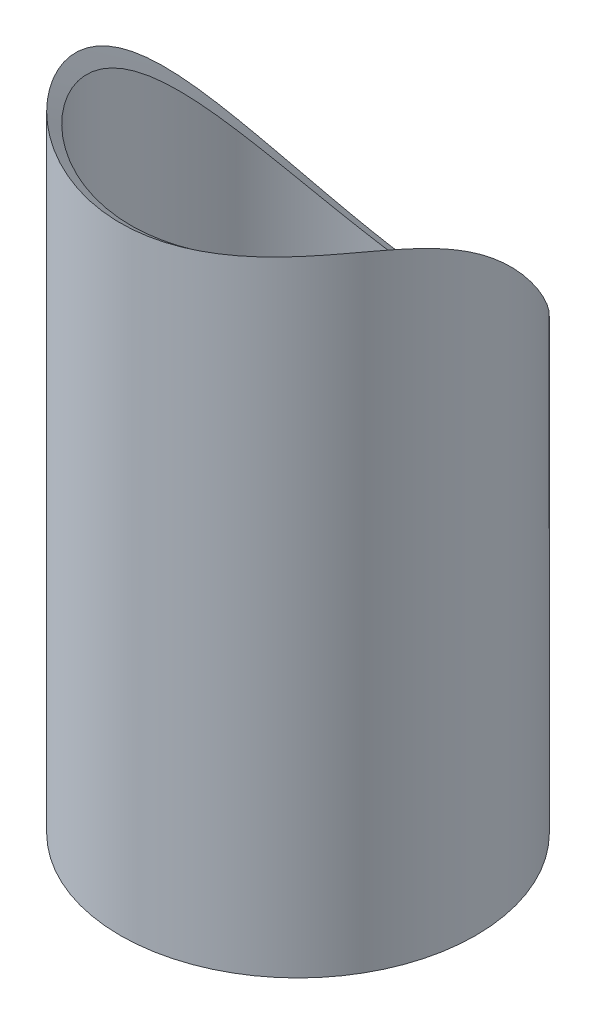
ISO-10303-21;
HEADER;
FILE_DESCRIPTION(('STEP AP214'),'2;1');
FILE_NAME('part.step','',(''),(''),'','','');
FILE_SCHEMA(('AUTOMOTIVE_DESIGN { 1 0 10303 214 1 1 1 1 }'));
ENDSEC;
DATA;
#1=APPLICATION_CONTEXT('core data for automotive mechanical design processes');
#2=APPLICATION_PROTOCOL_DEFINITION('international standard','automotive_design',2000,#1);
#3=PRODUCT_CONTEXT('',#1,'mechanical');
#4=PRODUCT('Part','Part','',(#3));
#5=PRODUCT_RELATED_PRODUCT_CATEGORY('part','',(#4));
#6=PRODUCT_DEFINITION_FORMATION('','',#4);
#7=PRODUCT_DEFINITION_CONTEXT('part definition',#1,'design');
#8=PRODUCT_DEFINITION('design','',#6,#7);
#9=PRODUCT_DEFINITION_SHAPE('','',#8);
#10=(LENGTH_UNIT() NAMED_UNIT(*) SI_UNIT(.MILLI.,.METRE.));
#11=(NAMED_UNIT(*) PLANE_ANGLE_UNIT() SI_UNIT($,.RADIAN.));
#12=(NAMED_UNIT(*) SI_UNIT($,.STERADIAN.) SOLID_ANGLE_UNIT());
#13=UNCERTAINTY_MEASURE_WITH_UNIT(LENGTH_MEASURE(1.E-05),#10,'distance_accuracy_value','');
#14=(GEOMETRIC_REPRESENTATION_CONTEXT(3) GLOBAL_UNCERTAINTY_ASSIGNED_CONTEXT((#13)) GLOBAL_UNIT_ASSIGNED_CONTEXT((#10,
#11,#12)) REPRESENTATION_CONTEXT('',''));
#15=CARTESIAN_POINT('',(0.,0.,0.));
#16=DIRECTION('',(0.,0.,1.));
#17=DIRECTION('',(1.,0.,0.));
#18=AXIS2_PLACEMENT_3D('',#15,#16,#17);
#19=CARTESIAN_POINT('',(0.,0.,0.));
#20=DIRECTION('',(0.,1.,0.));
#21=DIRECTION('',(0.,0.,1.));
#22=AXIS2_PLACEMENT_3D('',#19,#20,#21);
#23=PLANE('',#22);
#24=CARTESIAN_POINT('',(0.,0.,0.));
#25=DIRECTION('',(0.,1.,0.));
#26=DIRECTION('',(0.,0.,1.));
#27=AXIS2_PLACEMENT_3D('',#24,#25,#26);
#28=CIRCLE('',#27,50.);
#29=CARTESIAN_POINT('',(0.,0.,50.0000000000001));
#30=VERTEX_POINT('',#29);
#31=EDGE_CURVE('E57',#30,#30,#28,.T.);
#32=ORIENTED_EDGE('',*,*,#31,.F.);
#33=EDGE_LOOP('',(#32));
#34=FACE_BOUND('',#33,.T.);
#35=CARTESIAN_POINT('',(0.,0.,0.));
#36=DIRECTION('',(0.,1.,0.));
#37=DIRECTION('',(1.,0.,0.));
#38=AXIS2_PLACEMENT_3D('',#35,#36,#37);
#39=CIRCLE('',#38,47.);
#40=CARTESIAN_POINT('',(47.0000000000001,0.,0.));
#41=VERTEX_POINT('',#40);
#42=EDGE_CURVE('E93',#41,#41,#39,.T.);
#43=ORIENTED_EDGE('',*,*,#42,.T.);
#44=EDGE_LOOP('',(#43));
#45=FACE_BOUND('',#44,.T.);
#46=ADVANCED_FACE('F79',(#34,#45),#23,.F.);
#47=CARTESIAN_POINT('',(0.,200.,0.));
#48=DIRECTION('',(0.,-1.,0.));
#49=DIRECTION('',(0.,0.,-1.));
#50=AXIS2_PLACEMENT_3D('',#47,#48,#49);
#51=CYLINDRICAL_SURFACE('',#50,50.);
#52=CARTESIAN_POINT('',(0.,103.54753891394,-50.0000000000001));
#53=CARTESIAN_POINT('',(0.790983097082747,103.547548281499,-49.9999944809838));
#54=CARTESIAN_POINT('',(1.5820728397909,103.577987589637,-49.9811849455315));
#55=CARTESIAN_POINT('',(3.15790749509703,103.698937949652,-49.9064148181158));
#56=CARTESIAN_POINT('',(3.94265136665143,103.789458663373,-49.8504482508352));
#57=CARTESIAN_POINT('',(5.50063111049887,104.028302974754,-49.7026753397006));
#58=CARTESIAN_POINT('',(6.27385472295316,104.176684139773,-49.6108333019456));
#59=CARTESIAN_POINT('',(7.80300222481566,104.527606110436,-49.3934196295598));
#60=CARTESIAN_POINT('',(8.55892474146089,104.730151197679,-49.2678453284272));
#61=CARTESIAN_POINT('',(10.2242945315404,105.238291528995,-48.9524282235352));
#62=CARTESIAN_POINT('',(11.1282302412124,105.556911797768,-48.7544213063343));
#63=CARTESIAN_POINT('',(12.8990322333618,106.260861298202,-48.3161234452737));
#64=CARTESIAN_POINT('',(13.7658890890767,106.646207369699,-48.0758218270915));
#65=CARTESIAN_POINT('',(15.4610704932572,107.475082546013,-47.5577749644067));
#66=CARTESIAN_POINT('',(16.2893402714994,107.918691132512,-47.2799785549447));
#67=CARTESIAN_POINT('',(17.9052386332104,108.855215411398,-46.691989465065));
#68=CARTESIAN_POINT('',(18.6928651410854,109.348133618187,-46.381795132573));
#69=CARTESIAN_POINT('',(20.655954005357,110.662321862909,-45.5523471046869));
#70=CARTESIAN_POINT('',(21.8030155796812,111.513527172163,-45.0129029532022));
#71=CARTESIAN_POINT('',(23.4540416962351,112.848685041725,-44.1621034766726));
#72=CARTESIAN_POINT('',(23.9929934244806,113.303658650677,-43.8714386755792));
#73=CARTESIAN_POINT('',(25.0486592023601,114.230846331305,-43.2773783423852));
#74=CARTESIAN_POINT('',(25.5653739534121,114.703059858315,-42.9739832124329));
#75=CARTESIAN_POINT('',(26.5784144964433,115.66355659901,-42.3549411207104));
#76=CARTESIAN_POINT('',(27.074695375799,116.151871362314,-42.0392698571051));
#77=CARTESIAN_POINT('',(28.0465879921045,117.141769823869,-41.3971977088023));
#78=CARTESIAN_POINT('',(28.5221997940717,117.643353480374,-41.0707968578617));
#79=CARTESIAN_POINT('',(29.9192015428685,119.165372686456,-40.0767849252739));
#80=CARTESIAN_POINT('',(30.8110245180979,120.203331996601,-39.3942000697582));
#81=CARTESIAN_POINT('',(32.4233296432188,122.193119403359,-38.0747147137871));
#82=CARTESIAN_POINT('',(33.1517191948111,123.141114595502,-37.4415957075046));
#83=CARTESIAN_POINT('',(34.5555336532293,125.059074082457,-36.150033652177));
#84=CARTESIAN_POINT('',(35.2309502170447,126.029041806963,-35.4915866383251));
#85=CARTESIAN_POINT('',(36.532475377298,127.986383409243,-34.150431909123));
#86=CARTESIAN_POINT('',(37.1585480189541,128.973769349377,-33.4677070196967));
#87=CARTESIAN_POINT('',(38.3636307780623,130.960843404478,-32.0792266214624));
#88=CARTESIAN_POINT('',(38.9426432302837,131.960530906297,-31.3734722576395));
#89=CARTESIAN_POINT('',(40.056818768684,133.969971118203,-29.9379052023369));
#90=CARTESIAN_POINT('',(40.5919086930936,134.97973760066,-29.2080551000671));
#91=CARTESIAN_POINT('',(41.6189513800572,137.004081184989,-27.7250151318589));
#92=CARTESIAN_POINT('',(42.1109031024105,138.01865840224,-26.9718247037026));
#93=CARTESIAN_POINT('',(43.0526419486029,140.048520670791,-25.4416334396104));
#94=CARTESIAN_POINT('',(43.5024497176954,141.06380512745,-24.6646445121164));
#95=CARTESIAN_POINT('',(44.3608311819856,143.091913344426,-23.0851604041404));
#96=CARTESIAN_POINT('',(44.7694068650542,144.104737221071,-22.2826664557551));
#97=CARTESIAN_POINT('',(45.4426924915876,145.856797570768,-20.8663139423005));
#98=CARTESIAN_POINT('',(45.7168592173096,146.597498250612,-20.2587420026702));
#99=CARTESIAN_POINT('',(46.2427167365756,148.073765286323,-19.0278510079241));
#100=CARTESIAN_POINT('',(46.4944081635804,148.809331786356,-18.4045323972601));
#101=CARTESIAN_POINT('',(46.9749457695424,150.273624729548,-17.1409296949111));
#102=CARTESIAN_POINT('',(47.2037871242654,151.002349698987,-16.5006420565866));
#103=CARTESIAN_POINT('',(47.6378840095681,152.4506962367,-15.2019984729287));
#104=CARTESIAN_POINT('',(47.8431395707459,153.170317816782,-14.5436425510369));
#105=CARTESIAN_POINT('',(48.228581952785,154.596160612174,-13.2092730943881));
#106=CARTESIAN_POINT('',(48.4088338472,155.302412317998,-12.5333110486339));
#107=CARTESIAN_POINT('',(48.7436208857063,156.700747406566,-11.1605814001819));
#108=CARTESIAN_POINT('',(48.8981551435402,157.392830300317,-10.4638130814532));
#109=CARTESIAN_POINT('',(49.179757247941,158.759302864054,-9.04831394320659));
#110=CARTESIAN_POINT('',(49.3068380374677,159.433700739316,-8.32959365618144));
#111=CARTESIAN_POINT('',(49.5315007702963,160.76135282805,-6.86852404773863));
#112=CARTESIAN_POINT('',(49.6290864286828,161.414609695092,-6.12617771518964));
#113=CARTESIAN_POINT('',(49.8101768492328,162.836889043659,-4.45025596686124));
#114=CARTESIAN_POINT('',(49.8858563021166,163.599749180327,-3.51055008687836));
#115=CARTESIAN_POINT('',(49.983859861659,165.078898346698,-1.59237000236628));
#116=CARTESIAN_POINT('',(50.006188821553,165.795191606771,-0.613899332459995));
#117=CARTESIAN_POINT('',(49.9908732140887,167.170316568366,1.38044102716479));
#118=CARTESIAN_POINT('',(49.9533110349727,167.829225894591,2.39625746548627));
#119=CARTESIAN_POINT('',(49.8110810002399,169.080262257018,4.46421496298718));
#120=CARTESIAN_POINT('',(49.7064147696878,169.672390910046,5.51635514192756));
#121=CARTESIAN_POINT('',(49.49288248236,170.506736618431,7.12407835066739));
#122=CARTESIAN_POINT('',(49.411533420157,170.777527569509,7.66870487894411));
#123=CARTESIAN_POINT('',(49.2289787562489,171.298380810827,8.76447368200535));
#124=CARTESIAN_POINT('',(49.1277757587901,171.548445813583,9.31561509333017));
#125=CARTESIAN_POINT('',(48.9047769605676,172.027027166923,10.4231439186756));
#126=CARTESIAN_POINT('',(48.7829787565645,172.255540997864,10.9795319377564));
#127=CARTESIAN_POINT('',(48.5182363720867,172.690381077946,12.0958561305636));
#128=CARTESIAN_POINT('',(48.3752950474159,172.896710317073,12.655791815345));
#129=CARTESIAN_POINT('',(48.0678469087597,173.286922555449,13.7775274923708));
#130=CARTESIAN_POINT('',(47.9033412827032,173.470806790068,14.3393273802599));
#131=CARTESIAN_POINT('',(47.552542238708,173.81616753251,15.4629259095622));
#132=CARTESIAN_POINT('',(47.3662515192563,173.977646810197,16.0247245425279));
#133=CARTESIAN_POINT('',(46.9717925654821,174.278599749303,17.1465497511104));
#134=CARTESIAN_POINT('',(46.7636239370636,174.418073014206,17.7065762946186));
#135=CARTESIAN_POINT('',(46.325546155464,174.675683302399,18.8229516447404));
#136=CARTESIAN_POINT('',(46.095637709366,174.793821019259,19.3793005703386));
#137=CARTESIAN_POINT('',(45.4471865553849,175.084626264825,20.8709925760479));
#138=CARTESIAN_POINT('',(45.0084619255623,175.238239723284,21.8014057404495));
#139=CARTESIAN_POINT('',(44.0712797238227,175.492771367128,23.6386605835357));
#140=CARTESIAN_POINT('',(43.5728298535279,175.593696337768,24.5455052830815));
#141=CARTESIAN_POINT('',(42.5183907847825,175.74996337706,26.3298495494768));
#142=CARTESIAN_POINT('',(41.9623665830472,175.805277530516,27.2073308303403));
#143=CARTESIAN_POINT('',(40.7959397556141,175.877548184607,28.9269967421699));
#144=CARTESIAN_POINT('',(40.1855322357264,175.894501229328,29.7691781863018));
#145=CARTESIAN_POINT('',(38.8469145607811,175.897371291785,31.4997709134885));
#146=CARTESIAN_POINT('',(38.1130594444072,175.879861291859,32.3838215560227));
#147=CARTESIAN_POINT('',(36.5868445445125,175.815829817795,34.0986900095742));
#148=CARTESIAN_POINT('',(35.7944824887872,175.769307216386,34.9295057507915));
#149=CARTESIAN_POINT('',(34.1550802853137,175.655344778843,36.5341820058777));
#150=CARTESIAN_POINT('',(33.308025626031,175.587899373073,37.3080272862996));
#151=CARTESIAN_POINT('',(31.5634419858043,175.439242168574,38.7951440662902));
#152=CARTESIAN_POINT('',(30.6659095698144,175.35802943221,39.5084114351796));
#153=CARTESIAN_POINT('',(28.6602135812383,175.172926520932,40.9928475002312));
#154=CARTESIAN_POINT('',(27.5430215685663,175.06757442461,41.7516758381637));
#155=CARTESIAN_POINT('',(25.2509895228169,174.855123810355,43.1764843499988));
#156=CARTESIAN_POINT('',(24.0761437034145,174.748025117851,43.8424551785463));
#157=CARTESIAN_POINT('',(21.6756517195108,174.539268437552,45.0775831460782));
#158=CARTESIAN_POINT('',(20.4499896882561,174.437612172141,45.6467097591482));
#159=CARTESIAN_POINT('',(17.9558661280791,174.24569746909,46.684163945235));
#160=CARTESIAN_POINT('',(16.6874047655929,174.155438987134,47.152491910181));
#161=CARTESIAN_POINT('',(14.0607998398554,173.98752931674,48.0029137371846));
#162=CARTESIAN_POINT('',(12.7011394516878,173.910580844113,48.3804726424924));
#163=CARTESIAN_POINT('',(9.95371948959358,173.778258376631,49.0195138377699));
#164=CARTESIAN_POINT('',(8.56595887189534,173.722885184733,49.2809918076603));
#165=CARTESIAN_POINT('',(5.77267996576596,173.636478863762,49.6856866065272));
#166=CARTESIAN_POINT('',(4.36716352118579,173.605443228131,49.8289156142044));
#167=CARTESIAN_POINT('',(1.54874346917298,173.569204063404,49.995941232602));
#168=CARTESIAN_POINT('',(0.135840056831921,173.56399985551,50.0197409816865));
#169=CARTESIAN_POINT('',(-2.65625811152452,173.579497394173,49.9484960660645));
#170=CARTESIAN_POINT('',(-4.03552190686818,173.599642128556,49.8560067477792));
#171=CARTESIAN_POINT('',(-6.78108579279284,173.663963736267,49.5572770621398));
#172=CARTESIAN_POINT('',(-8.14738604876896,173.708140302565,49.3510381480487));
#173=CARTESIAN_POINT('',(-10.8572706055992,173.818448737004,48.8264695892398));
#174=CARTESIAN_POINT('',(-12.2008567723183,173.884578792459,48.5081491988849));
#175=CARTESIAN_POINT('',(-14.8560968634979,174.035549747859,47.761894220421));
#176=CARTESIAN_POINT('',(-16.1677505351509,174.120390795885,47.3339587648052));
#177=CARTESIAN_POINT('',(-18.7521207178939,174.30449282704,46.3709108695295));
#178=CARTESIAN_POINT('',(-20.0247862004232,174.403771806035,45.8356643542305));
#179=CARTESIAN_POINT('',(-21.8966260087779,174.559095135161,44.9556862207727));
#180=CARTESIAN_POINT('',(-22.5144584597711,174.611944436937,44.6494633747344));
#181=CARTESIAN_POINT('',(-23.7368328062425,174.718926201763,44.0117911633144));
#182=CARTESIAN_POINT('',(-24.3413758843466,174.773058549735,43.6803440544572));
#183=CARTESIAN_POINT('',(-25.5367222571219,174.881727437171,42.9924620974768));
#184=CARTESIAN_POINT('',(-26.1275132388448,174.936264285247,42.636005923082));
#185=CARTESIAN_POINT('',(-27.2938338307517,175.044662411753,41.8989553490279));
#186=CARTESIAN_POINT('',(-27.8693648176524,175.098523750893,41.5183631374382));
#187=CARTESIAN_POINT('',(-29.0043542413739,175.204452428737,40.7335674198545));
#188=CARTESIAN_POINT('',(-29.5638110452586,175.256519585281,40.3293615275687));
#189=CARTESIAN_POINT('',(-30.6656375353692,175.357613012672,39.4980367995572));
#190=CARTESIAN_POINT('',(-31.208008788428,175.40663956276,39.0709200746387));
#191=CARTESIAN_POINT('',(-32.2871519949282,175.501389939696,38.1842727026799));
#192=CARTESIAN_POINT('',(-32.8235052470036,175.547011322963,37.7242212314486));
#193=CARTESIAN_POINT('',(-33.8764509866426,175.632085605662,36.7815895381489));
#194=CARTESIAN_POINT('',(-34.3930454649561,175.671539127766,36.2990115966192));
#195=CARTESIAN_POINT('',(-35.4057072487907,175.742580981709,35.3119800152169));
#196=CARTESIAN_POINT('',(-35.9017697005111,175.774167462523,34.8075212597606));
#197=CARTESIAN_POINT('',(-36.8722338535328,175.827609128192,33.7777862537617));
#198=CARTESIAN_POINT('',(-37.3466380813615,175.849465450728,33.2525124448098));
#199=CARTESIAN_POINT('',(-38.2723708989749,175.881446750061,32.1826881853661));
#200=CARTESIAN_POINT('',(-38.7237249493125,175.891584950511,31.6381601796906));
#201=CARTESIAN_POINT('',(-39.6029166225312,175.898067225106,30.5304590753865));
#202=CARTESIAN_POINT('',(-40.0307572418902,175.894413061062,29.9672883672506));
#203=CARTESIAN_POINT('',(-40.8619360748437,175.871102458544,28.823630727688));
#204=CARTESIAN_POINT('',(-41.2652798482957,175.85144966585,28.243147770419));
#205=CARTESIAN_POINT('',(-42.0465696008691,175.793871385267,27.0663065871948));
#206=CARTESIAN_POINT('',(-42.4245175718328,175.755947332341,26.4699496114041));
#207=CARTESIAN_POINT('',(-43.337236400501,175.635308919848,24.9600629683232));
#208=CARTESIAN_POINT('',(-43.8555646838826,175.539669159577,24.0374999177165));
#209=CARTESIAN_POINT('',(-44.8299851914009,175.294426282922,22.1671886247783));
#210=CARTESIAN_POINT('',(-45.2860880916596,175.144832439625,21.2194447361905));
#211=CARTESIAN_POINT('',(-46.1333579789767,174.785387154671,19.3081370234184));
#212=CARTESIAN_POINT('',(-46.5246210918708,174.575626195537,18.3445989876499));
#213=CARTESIAN_POINT('',(-47.2418459029826,174.091071108358,16.4095326703831));
#214=CARTESIAN_POINT('',(-47.5678068868275,173.816276268945,15.4380043015954));
#215=CARTESIAN_POINT('',(-48.155067559013,173.199107943036,13.4952172660676));
#216=CARTESIAN_POINT('',(-48.4162742737067,172.856638542469,12.5239609643166));
#217=CARTESIAN_POINT('',(-48.8752316458619,172.105205642425,10.5923293067241));
#218=CARTESIAN_POINT('',(-49.0729832402523,171.696243124869,9.63195379042757));
#219=CARTESIAN_POINT('',(-49.4084569789377,170.815038589042,7.72909265277874));
#220=CARTESIAN_POINT('',(-49.546128917735,170.34274407661,6.78662262068821));
#221=CARTESIAN_POINT('',(-49.7655740596485,169.340661205744,4.92600525957411));
#222=CARTESIAN_POINT('',(-49.8473393485459,168.81086471955,4.00786139187071));
#223=CARTESIAN_POINT('',(-49.9432573598651,167.864030842599,2.46575208052377));
#224=CARTESIAN_POINT('',(-49.9702235288666,167.459664453128,1.83469432832949));
#225=CARTESIAN_POINT('',(-50.0004465436684,166.628140340219,0.587107737852147));
#226=CARTESIAN_POINT('',(-50.0037010339847,166.200980356744,-0.0294196509419782));
#227=CARTESIAN_POINT('',(-49.9881422285439,165.32620850431,-1.24779654205145));
#228=CARTESIAN_POINT('',(-49.9693206712676,164.878589039061,-1.84964046330979));
#229=CARTESIAN_POINT('',(-49.9111399098378,163.965387400996,-3.03846695228282));
#230=CARTESIAN_POINT('',(-49.8717811380366,163.499805606517,-3.62544983258138));
#231=CARTESIAN_POINT('',(-49.7737673312809,162.551323173413,-4.78672431111011));
#232=CARTESIAN_POINT('',(-49.7150506841147,162.068371680944,-5.36096905563601));
#233=CARTESIAN_POINT('',(-49.5796092900573,161.088580542099,-6.49527405143402));
#234=CARTESIAN_POINT('',(-49.5028846175467,160.591740953095,-7.05533436128308));
#235=CARTESIAN_POINT('',(-49.3325308522137,159.586045824261,-8.16178261018119));
#236=CARTESIAN_POINT('',(-49.2389038326838,159.07719176481,-8.70817221677067));
#237=CARTESIAN_POINT('',(-49.0356690603779,158.049015846929,-9.78799826998813));
#238=CARTESIAN_POINT('',(-48.9260603063963,157.52969333444,-10.3214339026461));
#239=CARTESIAN_POINT('',(-48.5950768228298,156.050323948283,-11.8105938696116));
#240=CARTESIAN_POINT('',(-48.3560377582438,155.079782666046,-12.7520336414294));
#241=CARTESIAN_POINT('',(-47.8311805381685,153.116327275422,-14.5979030385342));
#242=CARTESIAN_POINT('',(-47.5453541377892,152.123409250435,-15.5023261055395));
#243=CARTESIAN_POINT('',(-46.9291502082044,150.120708548956,-17.2782783580578));
#244=CARTESIAN_POINT('',(-46.5987380873907,149.110913316701,-18.1497813239395));
#245=CARTESIAN_POINT('',(-45.8950197274552,147.08050277474,-19.8621216185798));
#246=CARTESIAN_POINT('',(-45.5217159872257,146.059888098522,-20.7029607300772));
#247=CARTESIAN_POINT('',(-44.7324032658665,144.011198985091,-22.3573917843394));
#248=CARTESIAN_POINT('',(-44.3163497538668,142.983117827434,-23.1709541199987));
#249=CARTESIAN_POINT('',(-43.4417588925793,140.924583050442,-24.7718698143574));
#250=CARTESIAN_POINT('',(-42.9832204072686,139.894129368386,-25.55922247146));
#251=CARTESIAN_POINT('',(-42.0232217532335,137.835273317104,-27.1086500081089));
#252=CARTESIAN_POINT('',(-41.5217864907169,136.806870107582,-27.8707392039219));
#253=CARTESIAN_POINT('',(-40.4744796590866,134.755278720577,-29.370961831995));
#254=CARTESIAN_POINT('',(-39.9286106393379,133.732090247475,-30.1090966352327));
#255=CARTESIAN_POINT('',(-38.9505083972377,131.981103661235,-31.3575774475481));
#256=CARTESIAN_POINT('',(-38.5294591673308,131.251112081884,-31.873635376393));
#257=CARTESIAN_POINT('',(-37.6625430231638,129.797329559014,-32.8934766651397));
#258=CARTESIAN_POINT('',(-37.216676889288,129.073538421344,-33.397260410296));
#259=CARTESIAN_POINT('',(-36.2990047572282,127.633636580509,-34.3924478949479));
#260=CARTESIAN_POINT('',(-35.8271934661347,126.917527480384,-34.8838490783151));
#261=CARTESIAN_POINT('',(-34.8565341877132,125.494946903058,-35.8537692372402));
#262=CARTESIAN_POINT('',(-34.3576862315079,124.788475414765,-36.3322882276262));
#263=CARTESIAN_POINT('',(-33.3330086110959,123.389095216418,-37.2745717464152));
#264=CARTESIAN_POINT('',(-32.8072556901393,122.696154953001,-37.7383727284167));
#265=CARTESIAN_POINT('',(-31.7260370636909,121.324144025376,-38.6517714418311));
#266=CARTESIAN_POINT('',(-31.1705703892469,120.645073814462,-39.1013687093058));
#267=CARTESIAN_POINT('',(-30.028579789228,119.30377789576,-39.9850651307122));
#268=CARTESIAN_POINT('',(-29.4420705350607,118.641544445802,-40.4191714464284));
#269=CARTESIAN_POINT('',(-28.2360899729363,117.33676233551,-41.2706675816257));
#270=CARTESIAN_POINT('',(-27.6166226220204,116.694211326578,-41.6880593973971));
#271=CARTESIAN_POINT('',(-26.2338713747718,115.324385704715,-42.5742755130285));
#272=CARTESIAN_POINT('',(-25.4641074059804,114.601409633288,-43.0396915423055));
#273=CARTESIAN_POINT('',(-23.8737526706664,113.194220041003,-43.9417752368828));
#274=CARTESIAN_POINT('',(-23.0531619234769,112.510006505401,-44.3784429131181));
#275=CARTESIAN_POINT('',(-21.3587832524675,111.189159643531,-45.2183155430967));
#276=CARTESIAN_POINT('',(-20.485020722761,110.55250392294,-45.6215362565624));
#277=CARTESIAN_POINT('',(-18.6819763625482,109.336822256528,-46.3890410680019));
#278=CARTESIAN_POINT('',(-17.7527094024097,108.757780984882,-46.7533355225346));
#279=CARTESIAN_POINT('',(-16.0570179294006,107.794008056247,-47.3580686599244));
#280=CARTESIAN_POINT('',(-15.3019455012681,107.395121112136,-47.6077808344874));
#281=CARTESIAN_POINT('',(-13.758970017818,106.645222774718,-48.0764038001682));
#282=CARTESIAN_POINT('',(-12.9710672759258,106.294210924493,-48.2953148852515));
#283=CARTESIAN_POINT('',(-11.365833948457,105.647488289867,-48.6980624205634));
#284=CARTESIAN_POINT('',(-10.5485595517618,105.351677986166,-48.8819620031121));
#285=CARTESIAN_POINT('',(-8.88679092069349,104.821500427777,-49.211193479409));
#286=CARTESIAN_POINT('',(-8.04230575073793,104.587112944828,-49.3565380705927));
#287=CARTESIAN_POINT('',(-6.60239663512371,104.249561104868,-49.5656901323478));
#288=CARTESIAN_POINT('',(-6.01277411288505,104.128345873892,-49.6407433102818));
#289=CARTESIAN_POINT('',(-4.8252763059408,103.919171918942,-49.7702050962303));
#290=CARTESIAN_POINT('',(-4.22739996565578,103.831217490299,-49.824611037844));
#291=CARTESIAN_POINT('',(-3.02598742840173,103.689933006229,-49.911983907598));
#292=CARTESIAN_POINT('',(-2.42245114300101,103.636603492703,-49.9449505001991));
#293=CARTESIAN_POINT('',(-1.21263043016759,103.565406240356,-49.9889585693647));
#294=CARTESIAN_POINT('',(-0.606346549417538,103.547531733019,-50.0000042307309));
#295=CARTESIAN_POINT('',(0.,103.54753891394,-50.0000000000001));
#296=B_SPLINE_CURVE_WITH_KNOTS('',3,(#52,#53,#54,#55,#56,#57,#58,#59,#60,#61,#62,#63,#64,#65,
#66,#67,#68,#69,#70,#71,#72,#73,#74,#75,#76,#77,#78,#79,#80,#81,#82,#83,#84,#85,#86,#87,#88,#89,
#90,#91,#92,#93,#94,#95,#96,#97,#98,#99,#100,#101,#102,#103,#104,#105,#106,#107,#108,#109,#110,
#111,#112,#113,#114,#115,#116,#117,#118,#119,#120,#121,#122,#123,#124,#125,#126,#127,#128,#129,
#130,#131,#132,#133,#134,#135,#136,#137,#138,#139,#140,#141,#142,#143,#144,#145,#146,#147,#148,
#149,#150,#151,#152,#153,#154,#155,#156,#157,#158,#159,#160,#161,#162,#163,#164,#165,#166,#167,
#168,#169,#170,#171,#172,#173,#174,#175,#176,#177,#178,#179,#180,#181,#182,#183,#184,#185,#186,
#187,#188,#189,#190,#191,#192,#193,#194,#195,#196,#197,#198,#199,#200,#201,#202,#203,#204,#205,
#206,#207,#208,#209,#210,#211,#212,#213,#214,#215,#216,#217,#218,#219,#220,#221,#222,#223,#224,
#225,#226,#227,#228,#229,#230,#231,#232,#233,#234,#235,#236,#237,#238,#239,#240,#241,#242,#243,
#244,#245,#246,#247,#248,#249,#250,#251,#252,#253,#254,#255,#256,#257,#258,#259,#260,#261,#262,
#263,#264,#265,#266,#267,#268,#269,#270,#271,#272,#273,#274,#275,#276,#277,#278,#279,#280,#281,
#282,#283,#284,#285,#286,#287,#288,#289,#290,#291,#292,#293,#294,#295),.UNSPECIFIED.,.T.,.F.,(4,
2,2,2,2,2,2,2,2,2,2,2,2,2,2,2,2,2,2,2,2,2,2,2,2,2,2,2,2,2,2,2,2,2,2,2,2,2,2,2,2,2,2,2,2,2,2,2,2,
2,2,2,2,2,2,2,2,2,2,2,2,2,2,2,2,2,2,2,2,2,2,2,2,2,2,2,2,2,2,2,2,2,2,2,2,2,2,2,2,2,2,2,2,2,2,2,2,
2,2,2,2,2,2,2,2,2,2,2,2,2,2,2,2,2,2,2,2,2,2,2,2,4),(0.,2.3723358601556,4.74505331413873,
7.12013751465892,9.49540951848959,12.4270292484997,15.3593899234359,18.2957933005686,
21.2323464875195,25.8049496727326,28.0931044972893,30.3811870938923,32.6740561094396,
34.9669179119434,39.5514311452218,43.608395583618,47.6659976981436,51.7265295906686,
55.7868599073122,59.8538217827172,63.9208816986997,67.9859387326162,72.0507996893206,
75.0398503260976,78.028816690586,81.0184127738336,84.0080049785979,86.9896644415172,
89.9714266343396,92.9517799902303,95.9317577965735,99.5675588846475,103.20302921532,
106.833502785334,110.463888439168,112.304241899949,114.144354122254,115.984681214249,
117.824759959641,119.664737381786,121.50448712961,123.344270023311,125.183993099017,
128.300456795606,131.416519053075,134.534487021914,137.652735874165,141.096717407017,
144.540832762478,147.985865727013,151.431133412746,155.490495170044,159.550265174748,
163.611312483908,167.672344002462,171.906744981768,176.141303535742,180.375425909508,
184.609437018352,188.752014650972,192.894539359313,197.036722107129,201.17893763769,
205.326361117225,207.400619268411,209.474692077217,211.550555550257,213.626231102691,
215.702116777569,217.777811525581,219.901450950671,222.024875846683,224.148799889264,
226.272475530307,228.393752301113,230.514758113219,232.635280724306,234.755636824067,
237.939680427447,241.123177049819,244.301911037295,247.480679796636,250.663986510976,
253.847246220929,257.033160948208,260.21952658443,262.468641027369,264.717978891057,
266.968158793087,269.218291325939,271.475655854493,273.73301105937,275.990089558213,
278.247309516752,282.364777424451,286.482971697279,290.604379620539,294.725547549664,
298.851052726219,302.976668248167,307.099904454444,311.222904258588,314.187057518315,
317.151117620858,320.115784662369,323.080448291242,326.037081753235,328.993811688568,
331.94915647412,334.904147229945,338.364385458311,341.824622370502,345.283219496793,
348.740894139833,351.407929669212,354.074939742694,356.737094176792,359.39837078372,
361.217024216055,363.035912430918,364.854829111829,366.673398520164),.UNSPECIFIED.);
#297=CARTESIAN_POINT('',(0.,103.54753891394,-50.0000000000001));
#298=VERTEX_POINT('',#297);
#299=EDGE_CURVE('E99',#298,#298,#296,.T.);
#300=ORIENTED_EDGE('',*,*,#299,.T.);
#301=EDGE_LOOP('',(#300));
#302=FACE_BOUND('',#301,.T.);
#303=ORIENTED_EDGE('',*,*,#31,.T.);
#304=EDGE_LOOP('',(#303));
#305=FACE_BOUND('',#304,.T.);
#306=ADVANCED_FACE('F85',(#302,#305),#51,.T.);
#307=CARTESIAN_POINT('',(0.,200.,0.));
#308=DIRECTION('',(0.,-1.,0.));
#309=DIRECTION('',(0.,0.,-1.));
#310=AXIS2_PLACEMENT_3D('',#307,#308,#309);
#311=CYLINDRICAL_SURFACE('',#310,47.);
#312=CARTESIAN_POINT('',(0.,105.648161528569,-47.0000000000001));
#313=CARTESIAN_POINT('',(0.760946161704934,105.648155158991,-47.0000038529191));
#314=CARTESIAN_POINT('',(1.52184266396986,105.677108829171,-46.9814827438927));
#315=CARTESIAN_POINT('',(3.03743958897754,105.792109068987,-46.9078827101095));
#316=CARTESIAN_POINT('',(3.79214060838777,105.87815007384,-46.8528073486038));
#317=CARTESIAN_POINT('',(5.29027346153364,106.105150329784,-46.7073858699141));
#318=CARTESIAN_POINT('',(6.03369700076346,106.246148142717,-46.6170149866389));
#319=CARTESIAN_POINT('',(7.50401547901246,106.579624586776,-46.4030384475354));
#320=CARTESIAN_POINT('',(8.23090806632468,106.772110493545,-46.2794280947144));
#321=CARTESIAN_POINT('',(9.83146045502919,107.254767032917,-45.9690389789216));
#322=CARTESIAN_POINT('',(10.6998635845699,107.557247971049,-45.7742529154193));
#323=CARTESIAN_POINT('',(12.4011195607743,108.225534154446,-45.3429495111544));
#324=CARTESIAN_POINT('',(13.2339640333948,108.591354214615,-45.1064224069907));
#325=CARTESIAN_POINT('',(14.8626420975046,109.378238351837,-44.5963129216904));
#326=CARTESIAN_POINT('',(15.6584238715718,109.799376804288,-44.3226806364497));
#327=CARTESIAN_POINT('',(17.21090855396,110.688477475493,-43.7432434541172));
#328=CARTESIAN_POINT('',(17.9676092349469,111.156442358552,-43.4374367263294));
#329=CARTESIAN_POINT('',(19.8453808727024,112.398734786889,-42.6228383272714));
#330=CARTESIAN_POINT('',(20.9397404200041,113.200796182443,-42.0944034521137));
#331=CARTESIAN_POINT('',(22.5149822648318,114.458499579566,-41.2604984987459));
#332=CARTESIAN_POINT('',(23.029204232866,114.887016877216,-40.9755334288127));
#333=CARTESIAN_POINT('',(24.0363894901066,115.76015957282,-40.3929487219097));
#334=CARTESIAN_POINT('',(24.5293534315565,116.204784475786,-40.0953294737555));
#335=CARTESIAN_POINT('',(25.9795272349577,117.561654336408,-39.1838083165187));
#336=CARTESIAN_POINT('',(26.9059216162467,118.495198511868,-38.5523651023758));
#337=CARTESIAN_POINT('',(28.6824213210462,120.405173858596,-37.24958823343));
#338=CARTESIAN_POINT('',(29.5325341213332,121.381600812684,-36.5782584988685));
#339=CARTESIAN_POINT('',(31.0477029159794,123.227383912469,-35.2970335475429));
#340=CARTESIAN_POINT('',(31.7219622719634,124.09245999491,-34.6917959442));
#341=CARTESIAN_POINT('',(33.0219046335162,125.841582564891,-33.456804174741));
#342=CARTESIAN_POINT('',(33.6475805729273,126.725631788181,-32.827046462251));
#343=CARTESIAN_POINT('',(34.8533999131775,128.508615380204,-31.5438761094229));
#344=CARTESIAN_POINT('',(35.4335121169686,129.407559446006,-30.8904477016694));
#345=CARTESIAN_POINT('',(36.5499807633302,131.215722124868,-29.5609935777253));
#346=CARTESIAN_POINT('',(37.0863392118554,132.12494026472,-28.8849688994992));
#347=CARTESIAN_POINT('',(38.1178461591811,133.951367965483,-27.5094501871053));
#348=CARTESIAN_POINT('',(38.6129355488279,134.868586978649,-26.8099244370556));
#349=CARTESIAN_POINT('',(39.5623856809725,136.706365995011,-25.3879601045429));
#350=CARTESIAN_POINT('',(40.0167454433145,137.626926078056,-24.6655209712368));
#351=CARTESIAN_POINT('',(40.8853322026191,139.467584848828,-23.1973438900927));
#352=CARTESIAN_POINT('',(41.2995780510991,140.387683549144,-22.4516171063291));
#353=CARTESIAN_POINT('',(42.0884640705474,142.22441713024,-20.9354135723764));
#354=CARTESIAN_POINT('',(42.4631062656477,143.141052185734,-20.1649380897135));
#355=CARTESIAN_POINT('',(43.0811349985856,144.732011334888,-18.7995587180089));
#356=CARTESIAN_POINT('',(43.3334736945781,145.407933044821,-18.2105506070118));
#357=CARTESIAN_POINT('',(43.8158230576706,146.754244755172,-17.0172803734289));
#358=CARTESIAN_POINT('',(44.0458344167199,147.424634926429,-16.4130187242993));
#359=CARTESIAN_POINT('',(44.4830230727686,148.75824414786,-15.1882690915246));
#360=CARTESIAN_POINT('',(44.690196377315,149.421461925968,-14.5677782941514));
#361=CARTESIAN_POINT('',(45.080871844165,150.738644799155,-13.3097271605193));
#362=CARTESIAN_POINT('',(45.2643740135016,151.392609896984,-12.672166829332));
#363=CARTESIAN_POINT('',(45.6061894318365,152.687347976683,-11.3807062276624));
#364=CARTESIAN_POINT('',(45.7645687783698,153.328151580046,-10.7268542533394));
#365=CARTESIAN_POINT('',(46.055384441565,154.595910566234,-9.40014727921575));
#366=CARTESIAN_POINT('',(46.187819986637,155.222865536699,-8.72729171491345));
#367=CARTESIAN_POINT('',(46.4250168605633,156.4598532755,-7.36191122372583));
#368=CARTESIAN_POINT('',(46.5297899462701,157.069893133964,-6.66939479197835));
#369=CARTESIAN_POINT('',(46.7096939507066,158.270081911388,-5.26369544649322));
#370=CARTESIAN_POINT('',(46.7848282422261,158.860233086615,-4.55051489417997));
#371=CARTESIAN_POINT('',(46.9200461996706,160.18305132189,-2.89528449733715));
#372=CARTESIAN_POINT('',(46.9696473404302,160.908097035467,-1.94621336799185));
#373=CARTESIAN_POINT('',(47.0099408155397,162.311131838017,-0.0126153944769374));
#374=CARTESIAN_POINT('',(47.0006394449565,162.989125947692,0.971907649671035));
#375=CARTESIAN_POINT('',(46.9165230095861,164.28827438367,2.97354519916048));
#376=CARTESIAN_POINT('',(46.8417899124749,164.909498751684,3.99061739421784));
#377=CARTESIAN_POINT('',(46.6199476554884,166.087113969768,6.05446154554546));
#378=CARTESIAN_POINT('',(46.4728399976958,166.643506165087,7.10123288500617));
#379=CARTESIAN_POINT('',(46.1921493548739,167.426429629984,8.69372117494512));
#380=CARTESIAN_POINT('',(46.0877947124618,167.680115846372,9.23146878910917));
#381=CARTESIAN_POINT('',(45.8582841243683,168.168121151319,10.3112686489579));
#382=CARTESIAN_POINT('',(45.7331308017628,168.402442676532,10.8533203436248));
#383=CARTESIAN_POINT('',(45.4614257379195,168.851167973053,11.9403818028579));
#384=CARTESIAN_POINT('',(45.3148712231346,169.065569156829,12.4853919420041));
#385=CARTESIAN_POINT('',(44.9999674660922,169.474063823859,13.5766477431758));
#386=CARTESIAN_POINT('',(44.8316210293024,169.668159915364,14.1228932372846));
#387=CARTESIAN_POINT('',(44.4728229190616,170.036026874773,15.2150734795533));
#388=CARTESIAN_POINT('',(44.2823678314283,170.209794595078,15.7610081666001));
#389=CARTESIAN_POINT('',(43.879296827109,170.537147981828,16.8506597551439));
#390=CARTESIAN_POINT('',(43.666683542191,170.690736040159,17.3943769120679));
#391=CARTESIAN_POINT('',(43.2193263483564,170.978217070905,18.4779144184031));
#392=CARTESIAN_POINT('',(42.9845821438392,171.112109780191,19.0177347156607));
#393=CARTESIAN_POINT('',(42.4932070938494,171.360893889264,20.0916956947534));
#394=CARTESIAN_POINT('',(42.236576882643,171.47578583942,20.6258365406773));
#395=CARTESIAN_POINT('',(41.5079602055666,171.764151177484,22.0711996553085));
#396=CARTESIAN_POINT('',(41.0146112169919,171.919789087282,22.9753537243395));
#397=CARTESIAN_POINT('',(39.9662668125688,172.182939763964,24.7540648079608));
#398=CARTESIAN_POINT('',(39.4112785622431,172.290458117422,25.6286252474015));
#399=CARTESIAN_POINT('',(38.242374687861,172.464091047029,27.3422170815316));
#400=CARTESIAN_POINT('',(37.6284344907533,172.530188270375,28.1812334484697));
#401=CARTESIAN_POINT('',(36.3452008948165,172.62777714712,29.8179154064384));
#402=CARTESIAN_POINT('',(35.6759029230892,172.659265938571,30.6155775724815));
#403=CARTESIAN_POINT('',(34.2228999456967,172.695932163378,32.2347694098067));
#404=CARTESIAN_POINT('',(33.4343196847046,172.69848617749,33.051984828401));
#405=CARTESIAN_POINT('',(31.8002748980574,172.678581922657,34.6270198158783));
#406=CARTESIAN_POINT('',(30.9548083832373,172.656122778638,35.3848373057615));
#407=CARTESIAN_POINT('',(29.2114407999765,172.593516450671,36.8371985233063));
#408=CARTESIAN_POINT('',(28.3135260354126,172.553364628454,37.5317256012531));
#409=CARTESIAN_POINT('',(26.470185441365,172.461848486801,38.8537766675223));
#410=CARTESIAN_POINT('',(25.5247569341457,172.410483534881,39.481296873292));
#411=CARTESIAN_POINT('',(23.4619059835397,172.294940820991,40.7454427858424));
#412=CARTESIAN_POINT('',(22.3383854925508,172.229968140134,41.3720737372225));
#413=CARTESIAN_POINT('',(20.0437268813119,172.099825644956,42.5311833554937));
#414=CARTESIAN_POINT('',(18.8725849696746,172.034655815324,43.0636545077143));
#415=CARTESIAN_POINT('',(16.4900790511576,171.909805089522,44.0310180816025));
#416=CARTESIAN_POINT('',(15.2787066778725,171.850125344934,44.4658900586255));
#417=CARTESIAN_POINT('',(12.8239774979056,171.740800840609,45.2349412759622));
#418=CARTESIAN_POINT('',(11.5806209072776,171.691156013107,45.5691211962585));
#419=CARTESIAN_POINT('',(9.03575199613534,171.6041344916,46.1421998477503));
#420=CARTESIAN_POINT('',(7.7335800774034,171.567131823148,46.3782323826502));
#421=CARTESIAN_POINT('',(5.11357903774388,171.509832204374,46.7397062901556));
#422=CARTESIAN_POINT('',(3.79574952414884,171.489535673917,46.8651448832837));
#423=CARTESIAN_POINT('',(1.15413447380713,171.466970666151,47.004438307539));
#424=CARTESIAN_POINT('',(-0.169650664722693,171.464701000905,47.0183004913427));
#425=CARTESIAN_POINT('',(-2.81356323175479,171.478332994381,46.9343494704781));
#426=CARTESIAN_POINT('',(-4.13369071310607,171.494234389164,46.8365378878932));
#427=CARTESIAN_POINT('',(-6.74426916374582,171.542871475525,46.5319271309067));
#428=CARTESIAN_POINT('',(-8.0348848860937,171.575394601441,46.3265033363696));
#429=CARTESIAN_POINT('',(-10.5940886969078,171.655031342089,45.8090562660087));
#430=CARTESIAN_POINT('',(-11.8626769306468,171.702144860558,45.4970336934921));
#431=CARTESIAN_POINT('',(-14.3691151166915,171.80770346543,44.7686468612186));
#432=CARTESIAN_POINT('',(-15.6069636479061,171.866149074617,44.352277787374));
#433=CARTESIAN_POINT('',(-18.0434015738156,171.989926526928,43.4181780645372));
#434=CARTESIAN_POINT('',(-19.2419905229737,172.055258448166,42.9004462656962));
#435=CARTESIAN_POINT('',(-21.6011898307862,172.187676127507,41.7626195404383));
#436=CARTESIAN_POINT('',(-22.7614327279742,172.254771568717,41.1417605002801));
#437=CARTESIAN_POINT('',(-24.4596368403231,172.350952463698,40.1392431428968));
#438=CARTESIAN_POINT('',(-25.0187542292552,172.382273162906,39.7931452612766));
#439=CARTESIAN_POINT('',(-26.1220596167959,172.442384759871,39.0777439133639));
#440=CARTESIAN_POINT('',(-26.6662490426823,172.471175900067,38.7084426767556));
#441=CARTESIAN_POINT('',(-27.7391754625226,172.525133786895,37.9469536417505));
#442=CARTESIAN_POINT('',(-28.2679002718881,172.55029773388,37.5547484895798));
#443=CARTESIAN_POINT('',(-29.3084932103035,172.595752653899,36.7484069857597));
#444=CARTESIAN_POINT('',(-29.8203630221642,172.616044114687,36.3342728343454));
#445=CARTESIAN_POINT('',(-30.8264325531138,172.650442841906,35.4847092418188));
#446=CARTESIAN_POINT('',(-31.3206302935494,172.664549417827,35.0492774289574));
#447=CARTESIAN_POINT('',(-32.2903277921636,172.685159895559,34.1579910579891));
#448=CARTESIAN_POINT('',(-32.765829559506,172.691664616474,33.7021387057024));
#449=CARTESIAN_POINT('',(-33.6967092825133,172.69556455935,32.7713968654937));
#450=CARTESIAN_POINT('',(-34.1521111063094,172.692970897119,32.2965313077393));
#451=CARTESIAN_POINT('',(-35.0424492401985,172.677112321552,31.3282501729196));
#452=CARTESIAN_POINT('',(-35.4773879521697,172.663848663941,30.8348367852164));
#453=CARTESIAN_POINT('',(-36.3260280955275,172.624989562298,29.8303875520434));
#454=CARTESIAN_POINT('',(-36.7397259836401,172.599392068152,29.3193487900244));
#455=CARTESIAN_POINT('',(-37.54486760973,172.534157545671,28.2809910933345));
#456=CARTESIAN_POINT('',(-37.9363142382683,172.49452234577,27.7536742870672));
#457=CARTESIAN_POINT('',(-38.6955149552172,172.399559373288,26.684940277404));
#458=CARTESIAN_POINT('',(-39.0633075182738,172.344257917708,26.1435480921702));
#459=CARTESIAN_POINT('',(-39.7750475724107,172.216239549689,25.0474058607296));
#460=CARTESIAN_POINT('',(-40.1189983306424,172.143525029549,24.492657658852));
#461=CARTESIAN_POINT('',(-40.7823300120663,171.979049251236,23.3714737172537));
#462=CARTESIAN_POINT('',(-41.1017131016312,171.887289675099,22.8050390136457));
#463=CARTESIAN_POINT('',(-41.7152805576376,171.683213682462,21.6623148680971));
#464=CARTESIAN_POINT('',(-42.0094658698573,171.570898038015,21.0860257970071));
#465=CARTESIAN_POINT('',(-42.5395099472392,171.338686962169,19.992877037829));
#466=CARTESIAN_POINT('',(-42.7781771716842,171.221178238716,19.4768695539265));
#467=CARTESIAN_POINT('',(-43.2351804716788,170.968317203607,18.4401755170423));
#468=CARTESIAN_POINT('',(-43.4535147749711,170.832963339013,17.9194885605175));
#469=CARTESIAN_POINT('',(-43.869637834396,170.543900613113,16.8751520954149));
#470=CARTESIAN_POINT('',(-44.0674312166385,170.390195901517,16.351503282025));
#471=CARTESIAN_POINT('',(-44.442542469797,170.064052731837,15.3026363846191));
#472=CARTESIAN_POINT('',(-44.6198579809262,169.891612119139,14.7774181268866));
#473=CARTESIAN_POINT('',(-44.9540457980994,169.527973656774,13.7272439809479));
#474=CARTESIAN_POINT('',(-45.1109270521078,169.336784081823,13.2022880788562));
#475=CARTESIAN_POINT('',(-45.4046225811642,168.935717356592,12.1538802955462));
#476=CARTESIAN_POINT('',(-45.5414345407615,168.725838054508,11.6304285946915));
#477=CARTESIAN_POINT('',(-45.9223130211943,168.068628190445,10.0645096909069));
#478=CARTESIAN_POINT('',(-46.1368986520829,167.593641845518,9.0262359454262));
#479=CARTESIAN_POINT('',(-46.5092243404752,166.525313422426,6.87050958933651));
#480=CARTESIAN_POINT('',(-46.6593412257094,165.924936444974,5.75525825885178));
#481=CARTESIAN_POINT('',(-46.878049503543,164.651285585895,3.55906060754522));
#482=CARTESIAN_POINT('',(-46.946629323443,163.978001371209,2.4781191775738));
#483=CARTESIAN_POINT('',(-47.0107207825089,162.56822173372,0.353199893692285));
#484=CARTESIAN_POINT('',(-47.0060814810847,161.831598846598,-0.690697155262315));
#485=CARTESIAN_POINT('',(-46.9313717154747,160.307184489781,-2.73784291292621));
#486=CARTESIAN_POINT('',(-46.8612956414122,159.51938863843,-3.74108812887078));
#487=CARTESIAN_POINT('',(-46.6812407937068,158.054116221959,-5.52326528887747));
#488=CARTESIAN_POINT('',(-46.581196240747,157.383619576698,-6.30901119431509));
#489=CARTESIAN_POINT('',(-46.3455177694562,156.019956642225,-7.85523334215218));
#490=CARTESIAN_POINT('',(-46.209878677583,155.326787070414,-8.61570589304027));
#491=CARTESIAN_POINT('',(-45.9054697468283,153.921591496838,-10.1129508882618));
#492=CARTESIAN_POINT('',(-45.7366809693384,153.209554918353,-10.8497095033268));
#493=CARTESIAN_POINT('',(-45.3680384128258,151.770602670855,-12.3004547790971));
#494=CARTESIAN_POINT('',(-45.1681858960535,151.04368760746,-13.0144423636648));
#495=CARTESIAN_POINT('',(-44.7383301730215,149.575960157147,-14.4230934715355));
#496=CARTESIAN_POINT('',(-44.5082419411109,148.835113825733,-15.1176955411933));
#497=CARTESIAN_POINT('',(-44.019485419204,147.344318009426,-16.4867580756446));
#498=CARTESIAN_POINT('',(-43.7608169261828,146.594368459901,-17.1612183973143));
#499=CARTESIAN_POINT('',(-43.215731815237,145.088046017536,-18.490990076806));
#500=CARTESIAN_POINT('',(-42.9293232811485,144.331675054254,-19.1463069412753));
#501=CARTESIAN_POINT('',(-42.3291155479336,142.814518180538,-20.4390263076446));
#502=CARTESIAN_POINT('',(-42.0153162291117,142.053732250825,-21.0764287312438));
#503=CARTESIAN_POINT('',(-41.331116022599,140.461531046735,-22.3905274030611));
#504=CARTESIAN_POINT('',(-40.9581628685439,139.629894551596,-23.0656278281811));
#505=CARTESIAN_POINT('',(-40.1796890820782,137.966344421206,-24.3964515704156));
#506=CARTESIAN_POINT('',(-39.7741679690336,137.134430782046,-25.0521746013654));
#507=CARTESIAN_POINT('',(-38.9298772279594,135.472539476394,-26.3450361176023));
#508=CARTESIAN_POINT('',(-38.4910971665493,134.642562502305,-26.9821686834998));
#509=CARTESIAN_POINT('',(-37.5795229750952,132.987316194173,-28.237943153273));
#510=CARTESIAN_POINT('',(-37.1067293128278,132.162046795556,-28.8565853112751));
#511=CARTESIAN_POINT('',(-36.1277173802987,130.521838558448,-30.0731680038304));
#512=CARTESIAN_POINT('',(-35.6216284722868,129.706872884592,-30.6711763236115));
#513=CARTESIAN_POINT('',(-34.5729435125994,128.086952451002,-31.8485970593904));
#514=CARTESIAN_POINT('',(-34.0303459534603,127.28199810627,-32.4280087060598));
#515=CARTESIAN_POINT('',(-32.9071546112431,125.685704904943,-33.5672261093547));
#516=CARTESIAN_POINT('',(-32.3265830497902,124.894358421729,-34.1270430431125));
#517=CARTESIAN_POINT('',(-31.1250986017696,123.328454964906,-35.2262848914664));
#518=CARTESIAN_POINT('',(-30.5041914641789,122.553895619544,-35.7657126948376));
#519=CARTESIAN_POINT('',(-29.2299633239812,121.038025936815,-36.8141118749857));
#520=CARTESIAN_POINT('',(-28.5773339956479,120.296379683334,-37.3234359692575));
#521=CARTESIAN_POINT('',(-27.2280589081493,118.83797321259,-38.3188678220462));
#522=CARTESIAN_POINT('',(-26.5314169911352,118.12121083149,-38.8049776006075));
#523=CARTESIAN_POINT('',(-25.0903638336622,116.717224641462,-39.7519555482821));
#524=CARTESIAN_POINT('',(-24.3458919930712,116.030040223595,-40.2127902678241));
#525=CARTESIAN_POINT('',(-22.807154920693,114.693037080461,-41.1050439800544));
#526=CARTESIAN_POINT('',(-22.0128884086472,114.043219316745,-41.5364622158267));
#527=CARTESIAN_POINT('',(-20.3619857349283,112.78165699189,-42.3704514816311));
#528=CARTESIAN_POINT('',(-19.5047070973748,112.170473372759,-42.7726065605497));
#529=CARTESIAN_POINT('',(-17.7344488782724,111.005358928375,-43.5364037583789));
#530=CARTESIAN_POINT('',(-16.8214633200805,110.451434263515,-43.8980415184506));
#531=CARTESIAN_POINT('',(-14.9415590322171,109.414514466258,-44.5729165206049));
#532=CARTESIAN_POINT('',(-13.9747631132922,108.931366278494,-44.8862582825903));
#533=CARTESIAN_POINT('',(-11.9878873235806,108.048851902805,-45.4572018228349));
#534=CARTESIAN_POINT('',(-10.9678339441257,107.64944454719,-45.7148309918351));
#535=CARTESIAN_POINT('',(-9.13594633515849,107.034805284845,-46.1105787045189));
#536=CARTESIAN_POINT('',(-8.33416908857765,106.798418674852,-46.2625167374221));
#537=CARTESIAN_POINT('',(-6.7082664470119,106.387935910337,-46.526087807049));
#538=CARTESIAN_POINT('',(-5.8841442879922,106.213830787567,-46.6377266466922));
#539=CARTESIAN_POINT('',(-4.220881524479,105.933219465645,-46.8175485108437));
#540=CARTESIAN_POINT('',(-3.38176287822991,105.826621619516,-46.8857904509294));
#541=CARTESIAN_POINT('',(-1.69507514924233,105.684099134646,-46.9770121691833));
#542=CARTESIAN_POINT('',(-0.847506774649452,105.648168622711,-46.9999957087965));
#543=CARTESIAN_POINT('',(0.,105.648161528569,-47.0000000000001));
#544=B_SPLINE_CURVE_WITH_KNOTS('',3,(#312,#313,#314,#315,#316,#317,#318,#319,#320,#321,#322,
#323,#324,#325,#326,#327,#328,#329,#330,#331,#332,#333,#334,#335,#336,#337,#338,#339,#340,#341,
#342,#343,#344,#345,#346,#347,#348,#349,#350,#351,#352,#353,#354,#355,#356,#357,#358,#359,#360,
#361,#362,#363,#364,#365,#366,#367,#368,#369,#370,#371,#372,#373,#374,#375,#376,#377,#378,#379,
#380,#381,#382,#383,#384,#385,#386,#387,#388,#389,#390,#391,#392,#393,#394,#395,#396,#397,#398,
#399,#400,#401,#402,#403,#404,#405,#406,#407,#408,#409,#410,#411,#412,#413,#414,#415,#416,#417,
#418,#419,#420,#421,#422,#423,#424,#425,#426,#427,#428,#429,#430,#431,#432,#433,#434,#435,#436,
#437,#438,#439,#440,#441,#442,#443,#444,#445,#446,#447,#448,#449,#450,#451,#452,#453,#454,#455,
#456,#457,#458,#459,#460,#461,#462,#463,#464,#465,#466,#467,#468,#469,#470,#471,#472,#473,#474,
#475,#476,#477,#478,#479,#480,#481,#482,#483,#484,#485,#486,#487,#488,#489,#490,#491,#492,#493,
#494,#495,#496,#497,#498,#499,#500,#501,#502,#503,#504,#505,#506,#507,#508,#509,#510,#511,#512,
#513,#514,#515,#516,#517,#518,#519,#520,#521,#522,#523,#524,#525,#526,#527,#528,#529,#530,#531,
#532,#533,#534,#535,#536,#537,#538,#539,#540,#541,#542,#543),.UNSPECIFIED.,.T.,.F.,(4,2,2,2,2,2,
2,2,2,2,2,2,2,2,2,2,2,2,2,2,2,2,2,2,2,2,2,2,2,2,2,2,2,2,2,2,2,2,2,2,2,2,2,2,2,2,2,2,2,2,2,2,2,2,
2,2,2,2,2,2,2,2,2,2,2,2,2,2,2,2,2,2,2,2,2,2,2,2,2,2,2,2,2,2,2,2,2,2,2,2,2,2,2,2,2,2,2,2,2,2,2,2,
2,2,2,2,2,2,2,2,2,2,2,2,2,4),(0.,2.28198726668193,4.56375212148834,6.8471209252773,
9.13081255634277,11.9464991674262,14.7628452542432,17.5830174266133,20.4033501510381,
24.7640301148997,26.9461030551164,29.1281089967761,33.5008607118013,37.8731833601882,
41.6299267279101,45.3872154712629,49.1470547649765,52.9067215863893,56.6716839753362,
60.4367369435422,64.200011851219,67.9630943258336,70.7568748655049,73.5505687951039,
76.3447503346528,79.138931044014,81.9256338287387,84.7124194797242,87.4980188022568,
90.2833010419407,93.8667262259865,97.4497684463817,101.028328527638,104.606814341547,
106.417257620989,108.227472745038,110.037922677509,111.848139766054,113.658636774605,
115.468918991779,117.279225392143,119.089479346851,122.210774198359,125.331706580476,
128.453945561107,131.576442716277,134.979997598633,138.383671556405,141.788238344267,
145.192997219184,149.052860866018,152.913032420537,156.774011833604,160.634965172543,
164.601865058739,168.568864639315,172.535602799901,176.502283343571,180.419460407316,
184.336611627188,188.253943600434,192.171320014084,196.119134825006,198.093600543538,
200.067876818714,202.043668870783,204.019263057008,205.995077752404,207.970679533161,
209.943868494159,211.916825269346,213.890110099796,215.863138001099,217.832870962594,
219.802333466779,221.771622104548,223.740836794242,225.481849032577,227.223012879212,
228.963783736483,230.704754993382,232.444961314296,234.185368250043,237.665381456272,
241.48613420695,245.307429179089,249.136602745124,252.966104615307,256.078220035482,
259.19078804155,262.305139475884,265.419364394096,268.542542099536,271.665741992455,
274.788034464085,277.910340580572,281.312379535272,284.714468706071,288.117629569618,
291.520743639667,294.911338221532,298.302072889052,301.690840817621,305.079126804765,
308.412289335258,311.745161292838,315.082342586938,318.419609717716,321.797574801776,
325.175902937885,328.546813973395,331.91606393507,334.461677014953,337.006923390566,
339.548706924276,342.090279200354),.UNSPECIFIED.);
#545=CARTESIAN_POINT('',(0.,105.648161528569,-47.0000000000001));
#546=VERTEX_POINT('',#545);
#547=EDGE_CURVE('E83',#546,#546,#544,.T.);
#548=ORIENTED_EDGE('',*,*,#547,.F.);
#549=EDGE_LOOP('',(#548));
#550=FACE_BOUND('',#549,.T.);
#551=ORIENTED_EDGE('',*,*,#42,.F.);
#552=EDGE_LOOP('',(#551));
#553=FACE_BOUND('',#552,.T.);
#554=ADVANCED_FACE('F106',(#550,#553),#311,.F.);
#555=CARTESIAN_POINT('',(0.,236.737669159099,24.2760071185446));
#556=DIRECTION('',(0.,-0.573576436351044,-0.819152044288995));
#557=DIRECTION('',(0.,0.819152044288993,-0.573576436351045));
#558=AXIS2_PLACEMENT_3D('',#555,#556,#557);
#559=CYLINDRICAL_SURFACE('',#558,66.5);
#560=ORIENTED_EDGE('',*,*,#547,.T.);
#561=EDGE_LOOP('',(#560));
#562=FACE_BOUND('',#561,.T.);
#563=ORIENTED_EDGE('',*,*,#299,.F.);
#564=EDGE_LOOP('',(#563));
#565=FACE_BOUND('',#564,.T.);
#566=ADVANCED_FACE('F104',(#562,#565),#559,.F.);
#567=CLOSED_SHELL('',(#46,#306,#554,#566));
#568=MANIFOLD_SOLID_BREP('B7',#567);
#569=ADVANCED_BREP_SHAPE_REPRESENTATION('',(#18,#568),#14);
#570=SHAPE_DEFINITION_REPRESENTATION(#9,#569);
ENDSEC;
END-ISO-10303-21;
